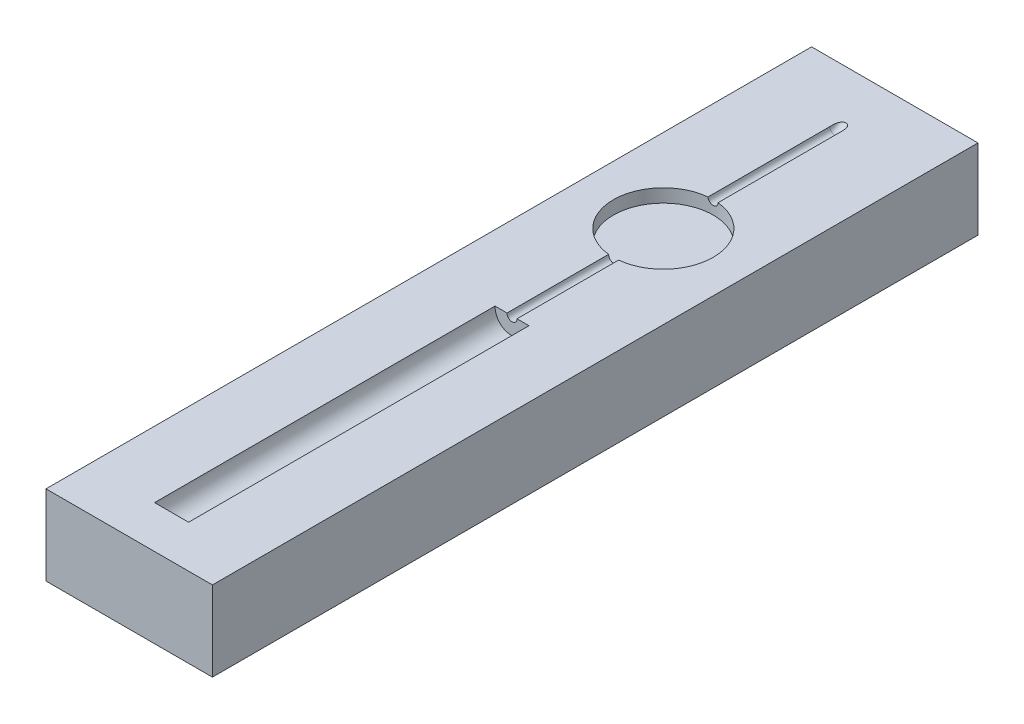
ISO-10303-21;
HEADER;
FILE_DESCRIPTION(('STEP AP214'),'2;1');
FILE_NAME('part.step','',(''),(''),'','','');
FILE_SCHEMA(('AUTOMOTIVE_DESIGN { 1 0 10303 214 1 1 1 1 }'));
ENDSEC;
DATA;
#1=APPLICATION_CONTEXT('core data for automotive mechanical design processes');
#2=APPLICATION_PROTOCOL_DEFINITION('international standard','automotive_design',2000,#1);
#3=PRODUCT_CONTEXT('',#1,'mechanical');
#4=PRODUCT('Part','Part','',(#3));
#5=PRODUCT_RELATED_PRODUCT_CATEGORY('part','',(#4));
#6=PRODUCT_DEFINITION_FORMATION('','',#4);
#7=PRODUCT_DEFINITION_CONTEXT('part definition',#1,'design');
#8=PRODUCT_DEFINITION('design','',#6,#7);
#9=PRODUCT_DEFINITION_SHAPE('','',#8);
#10=(LENGTH_UNIT() NAMED_UNIT(*) SI_UNIT(.MILLI.,.METRE.));
#11=(NAMED_UNIT(*) PLANE_ANGLE_UNIT() SI_UNIT($,.RADIAN.));
#12=(NAMED_UNIT(*) SI_UNIT($,.STERADIAN.) SOLID_ANGLE_UNIT());
#13=UNCERTAINTY_MEASURE_WITH_UNIT(LENGTH_MEASURE(1.E-05),#10,'distance_accuracy_value','');
#14=(GEOMETRIC_REPRESENTATION_CONTEXT(3) GLOBAL_UNCERTAINTY_ASSIGNED_CONTEXT((#13)) GLOBAL_UNIT_ASSIGNED_CONTEXT((#10,
#11,#12)) REPRESENTATION_CONTEXT('',''));
#15=CARTESIAN_POINT('',(0.,0.,0.));
#16=DIRECTION('',(0.,0.,1.));
#17=DIRECTION('',(1.,0.,0.));
#18=AXIS2_PLACEMENT_3D('',#15,#16,#17);
#19=CARTESIAN_POINT('',(0.,0.,0.));
#20=DIRECTION('',(0.,1.,0.));
#21=DIRECTION('',(0.,0.,1.));
#22=AXIS2_PLACEMENT_3D('',#19,#20,#21);
#23=PLANE('',#22);
#24=DIRECTION('',(-1.,0.,0.));
#25=VECTOR('',#24,1.);
#26=CARTESIAN_POINT('',(-25.,0.,115.));
#27=LINE('',#26,#25);
#28=CARTESIAN_POINT('',(25.,0.,115.));
#29=VERTEX_POINT('',#28);
#30=CARTESIAN_POINT('',(-25.,0.,115.));
#31=VERTEX_POINT('',#30);
#32=EDGE_CURVE('E274',#29,#31,#27,.T.);
#33=ORIENTED_EDGE('',*,*,#32,.F.);
#34=DIRECTION('',(0.,0.,1.));
#35=VECTOR('',#34,1.);
#36=CARTESIAN_POINT('',(25.,0.,115.));
#37=LINE('',#36,#35);
#38=CARTESIAN_POINT('',(25.,0.,-115.));
#39=VERTEX_POINT('',#38);
#40=EDGE_CURVE('E271',#39,#29,#37,.T.);
#41=ORIENTED_EDGE('',*,*,#40,.F.);
#42=DIRECTION('',(-1.,0.,0.));
#43=VECTOR('',#42,1.);
#44=CARTESIAN_POINT('',(-25.,0.,-115.));
#45=LINE('',#44,#43);
#46=CARTESIAN_POINT('',(-25.,0.,-115.));
#47=VERTEX_POINT('',#46);
#48=EDGE_CURVE('E162',#39,#47,#45,.T.);
#49=ORIENTED_EDGE('',*,*,#48,.T.);
#50=DIRECTION('',(0.,0.,1.));
#51=VECTOR('',#50,1.);
#52=CARTESIAN_POINT('',(-25.,0.,115.));
#53=LINE('',#52,#51);
#54=EDGE_CURVE('E277',#47,#31,#53,.T.);
#55=ORIENTED_EDGE('',*,*,#54,.T.);
#56=EDGE_LOOP('',(#33,#41,#49,#55));
#57=FACE_BOUND('',#56,.T.);
#58=DIRECTION('',(1.,0.,0.));
#59=VECTOR('',#58,1.);
#60=CARTESIAN_POINT('',(-5.105,0.,0.));
#61=LINE('',#60,#59);
#62=CARTESIAN_POINT('',(1.5,0.,0.));
#63=VERTEX_POINT('',#62);
#64=CARTESIAN_POINT('',(5.105,0.,0.));
#65=VERTEX_POINT('',#64);
#66=EDGE_CURVE('E154',#63,#65,#61,.T.);
#67=ORIENTED_EDGE('',*,*,#66,.T.);
#68=DIRECTION('',(0.,0.,-1.));
#69=VECTOR('',#68,1.);
#70=CARTESIAN_POINT('',(5.105,0.,102.27454));
#71=LINE('',#70,#69);
#72=CARTESIAN_POINT('',(5.105,0.,102.27454));
#73=VERTEX_POINT('',#72);
#74=EDGE_CURVE('E11',#65,#73,#71,.F.);
#75=ORIENTED_EDGE('',*,*,#74,.T.);
#76=DIRECTION('',(1.,0.,0.));
#77=VECTOR('',#76,1.);
#78=CARTESIAN_POINT('',(-5.105,0.,102.27454));
#79=LINE('',#78,#77);
#80=CARTESIAN_POINT('',(1.5,0.,102.27454));
#81=VERTEX_POINT('',#80);
#82=EDGE_CURVE('E140',#81,#73,#79,.T.);
#83=ORIENTED_EDGE('',*,*,#82,.F.);
#84=DIRECTION('',(1.,0.,0.));
#85=VECTOR('',#84,1.);
#86=CARTESIAN_POINT('',(0.,0.,102.27454));
#87=LINE('',#86,#85);
#88=CARTESIAN_POINT('',(-1.5,0.,102.27454));
#89=VERTEX_POINT('',#88);
#90=EDGE_CURVE('E125',#89,#81,#87,.T.);
#91=ORIENTED_EDGE('',*,*,#90,.F.);
#92=CARTESIAN_POINT('',(-5.105,0.,102.27454));
#93=VERTEX_POINT('',#92);
#94=EDGE_CURVE('E142',#93,#89,#79,.T.);
#95=ORIENTED_EDGE('',*,*,#94,.F.);
#96=DIRECTION('',(0.,0.,-1.));
#97=VECTOR('',#96,1.);
#98=CARTESIAN_POINT('',(-5.105,0.,102.27454));
#99=LINE('',#98,#97);
#100=CARTESIAN_POINT('',(-5.105,0.,0.));
#101=VERTEX_POINT('',#100);
#102=EDGE_CURVE('E49',#93,#101,#99,.T.);
#103=ORIENTED_EDGE('',*,*,#102,.T.);
#104=CARTESIAN_POINT('',(-1.5,0.,0.));
#105=VERTEX_POINT('',#104);
#106=EDGE_CURVE('E150',#101,#105,#61,.T.);
#107=ORIENTED_EDGE('',*,*,#106,.T.);
#108=DIRECTION('',(0.,0.,-1.));
#109=VECTOR('',#108,1.);
#110=CARTESIAN_POINT('',(-1.5,0.,102.27454));
#111=LINE('',#110,#109);
#112=CARTESIAN_POINT('',(-1.5,0.,-30.5378801602227));
#113=VERTEX_POINT('',#112);
#114=EDGE_CURVE('E250',#105,#113,#111,.T.);
#115=ORIENTED_EDGE('',*,*,#114,.T.);
#116=CARTESIAN_POINT('',(0.,0.,-45.462691716822));
#117=DIRECTION('',(0.,1.,0.));
#118=DIRECTION('',(0.,0.,1.));
#119=AXIS2_PLACEMENT_3D('',#116,#117,#118);
#120=CIRCLE('',#119,15.);
#121=CARTESIAN_POINT('',(-1.5,0.,-60.3875032734213));
#122=VERTEX_POINT('',#121);
#123=EDGE_CURVE('E219',#122,#113,#120,.T.);
#124=ORIENTED_EDGE('',*,*,#123,.F.);
#125=DIRECTION('',(0.,0.,-1.));
#126=VECTOR('',#125,1.);
#127=CARTESIAN_POINT('',(-1.5,0.,102.27454));
#128=LINE('',#127,#126);
#129=CARTESIAN_POINT('',(-1.5,0.,-97.));
#130=VERTEX_POINT('',#129);
#131=EDGE_CURVE('E220',#122,#130,#128,.T.);
#132=ORIENTED_EDGE('',*,*,#131,.T.);
#133=CARTESIAN_POINT('',(0.,0.,-100.35410196625));
#134=CARTESIAN_POINT('',(0.0672307867824901,0.,-100.354096630468));
#135=CARTESIAN_POINT('',(0.134554806970392,0.,-100.347994758443));
#136=CARTESIAN_POINT('',(0.267123437779811,0.,-100.32392435141));
#137=CARTESIAN_POINT('',(0.332363320649592,0.,-100.305930602289));
#138=CARTESIAN_POINT('',(0.458517043906197,0.,-100.259204560447));
#139=CARTESIAN_POINT('',(0.519448956126106,0.,-100.230520739154));
#140=CARTESIAN_POINT('',(0.635925306877005,0.,-100.163870009883));
#141=CARTESIAN_POINT('',(0.691471005151739,0.,-100.125905279901));
#142=CARTESIAN_POINT('',(0.799248566690285,0.,-100.040028521794));
#143=CARTESIAN_POINT('',(0.851137095835231,0.,-99.9916885328437));
#144=CARTESIAN_POINT('',(0.947720598887968,0.,-99.8883103355379));
#145=CARTESIAN_POINT('',(0.992410158207161,0.,-99.8332671396074));
#146=CARTESIAN_POINT('',(1.09911156459117,0.,-99.6838803764388));
#147=CARTESIAN_POINT('',(1.15564343285398,0.,-99.5856145816269));
#148=CARTESIAN_POINT('',(1.25237794690646,0.,-99.3815266486391));
#149=CARTESIAN_POINT('',(1.29256117388616,0.,-99.2756956989443));
#150=CARTESIAN_POINT('',(1.36308003437101,0.,-99.0480333939666));
#151=CARTESIAN_POINT('',(1.39183487387045,0.,-98.9257270013727));
#152=CARTESIAN_POINT('',(1.43678650873765,0.,-98.678757161986));
#153=CARTESIAN_POINT('',(1.45295915056854,0.,-98.5540896500442));
#154=CARTESIAN_POINT('',(1.4767550206887,0.,-98.3031379341571));
#155=CARTESIAN_POINT('',(1.48431713217746,0.,-98.1768485294598));
#156=CARTESIAN_POINT('',(1.49434362566474,0.,-97.92405197641));
#157=CARTESIAN_POINT('',(1.49680552441963,0.,-97.7975447519895));
#158=CARTESIAN_POINT('',(1.49904038727571,0.,-97.5898828441239));
#159=CARTESIAN_POINT('',(1.4994609826423,0.,-97.5087310653113));
#160=CARTESIAN_POINT('',(1.49992619235798,0.,-97.3464260708259));
#161=CARTESIAN_POINT('',(1.49997080632203,0.,-97.2652728551517));
#162=CARTESIAN_POINT('',(1.50000795710064,0.,-97.1029435905487));
#163=CARTESIAN_POINT('',(1.50000047908994,0.,-97.0217675416949));
#164=CARTESIAN_POINT('',(1.49999929025183,0.,-96.8594115821137));
#165=CARTESIAN_POINT('',(1.50000558006921,0.,-96.7782316713835));
#166=CARTESIAN_POINT('',(1.49983961930328,0.,-96.6162593735906));
#167=CARTESIAN_POINT('',(1.49966822086254,0.,-96.5354669865241));
#168=CARTESIAN_POINT('',(1.4987201710547,0.,-96.3738813679862));
#169=CARTESIAN_POINT('',(1.49794349673059,0.,-96.293088136599));
#170=CARTESIAN_POINT('',(1.49515570446314,0.,-96.1315602275125));
#171=CARTESIAN_POINT('',(1.49314520955794,0.,-96.0508255408376));
#172=CARTESIAN_POINT('',(1.48710145400768,0.,-95.889433657129));
#173=CARTESIAN_POINT('',(1.48306842387874,0.,-95.8087764523138));
#174=CARTESIAN_POINT('',(1.47299277494263,0.,-95.6611943308));
#175=CARTESIAN_POINT('',(1.46740193128519,0.,-95.5942401943196));
#176=CARTESIAN_POINT('',(1.45361415230674,0.,-95.4605960115322));
#177=CARTESIAN_POINT('',(1.44541698821279,0.,-95.3939059889286));
#178=CARTESIAN_POINT('',(1.41599227240695,0.,-95.1943212039969));
#179=CARTESIAN_POINT('',(1.38993947024899,0.,-95.0620704020673));
#180=CARTESIAN_POINT('',(1.31923487077032,0.,-94.7999296565847));
#181=CARTESIAN_POINT('',(1.27429014962835,0.,-94.6701120905019));
#182=CARTESIAN_POINT('',(1.18930860246558,0.,-94.4835763311824));
#183=CARTESIAN_POINT('',(1.15809832438021,0.,-94.4228257030507));
#184=CARTESIAN_POINT('',(1.0893534319166,0.,-94.3050446656123));
#185=CARTESIAN_POINT('',(1.05182447438382,0.,-94.2480109914699));
#186=CARTESIAN_POINT('',(0.964180180254391,0.,-94.1309764845206));
#187=CARTESIAN_POINT('',(0.913029677374067,0.,-94.0717381517388));
#188=CARTESIAN_POINT('',(0.801996887643482,0.,-93.962027139652));
#189=CARTESIAN_POINT('',(0.742117344625086,0.,-93.911551716752));
#190=CARTESIAN_POINT('',(0.613784947728565,0.,-93.8214897023238));
#191=CARTESIAN_POINT('',(0.545262173574133,0.,-93.7820014528515));
#192=CARTESIAN_POINT('',(0.40183050332942,0.,-93.7170777791347));
#193=CARTESIAN_POINT('',(0.326927302291188,0.,-93.6916299712752));
#194=CARTESIAN_POINT('',(0.183162566087263,0.,-93.6588667243544));
#195=CARTESIAN_POINT('',(0.114726974066683,0.,-93.6496724175345));
#196=CARTESIAN_POINT('',(-0.0226618598245099,0.,-93.644019500176));
#197=CARTESIAN_POINT('',(-0.0916148809165694,0.,-93.6475557352935));
#198=CARTESIAN_POINT('',(-0.222183945601393,0.,-93.6663289478414));
#199=CARTESIAN_POINT('',(-0.283942726359025,0.,-93.6805976727889));
#200=CARTESIAN_POINT('',(-0.404299870766039,0.,-93.7189355164065));
#201=CARTESIAN_POINT('',(-0.462898993324443,0.,-93.7430022697356));
#202=CARTESIAN_POINT('',(-0.577791646591143,0.,-93.8008768156348));
#203=CARTESIAN_POINT('',(-0.633918403822543,0.,-93.8350135673147));
#204=CARTESIAN_POINT('',(-0.740565367096012,0.,-93.9111810508322));
#205=CARTESIAN_POINT('',(-0.791078590207105,0.,-93.9532214432829));
#206=CARTESIAN_POINT('',(-0.905523365257182,0.,-94.0623241232702));
#207=CARTESIAN_POINT('',(-0.966428419692527,0.,-94.1325659549204));
#208=CARTESIAN_POINT('',(-1.07589226119924,0.,-94.2818537058273));
#209=CARTESIAN_POINT('',(-1.12445542473782,0.,-94.3608964899041));
#210=CARTESIAN_POINT('',(-1.19892394114143,0.,-94.5031559157308));
#211=CARTESIAN_POINT('',(-1.22742712078311,0.,-94.5650488662927));
#212=CARTESIAN_POINT('',(-1.27887287693451,0.,-94.6911377801969));
#213=CARTESIAN_POINT('',(-1.30181177272873,0.,-94.755335235893));
#214=CARTESIAN_POINT('',(-1.34285376332618,0.,-94.8856900374737));
#215=CARTESIAN_POINT('',(-1.36092466805315,0.,-94.95185736376));
#216=CARTESIAN_POINT('',(-1.39268769421189,0.,-95.0851544222037));
#217=CARTESIAN_POINT('',(-1.40638370944741,0.,-95.1522832426745));
#218=CARTESIAN_POINT('',(-1.44273965338481,0.,-95.359094797791));
#219=CARTESIAN_POINT('',(-1.45938735309894,0.,-95.4998230797753));
#220=CARTESIAN_POINT('',(-1.48263843909134,0.,-95.7821596026391));
#221=CARTESIAN_POINT('',(-1.48922505318717,0.,-95.9237689186114));
#222=CARTESIAN_POINT('',(-1.49728720656969,0.,-96.2079105692423));
#223=CARTESIAN_POINT('',(-1.49873316533856,0.,-96.3504435328242));
#224=CARTESIAN_POINT('',(-1.49972794014842,0.,-96.56417706356));
#225=CARTESIAN_POINT('',(-1.49986402532073,0.,-96.6353809411881));
#226=CARTESIAN_POINT('',(-1.49999936674925,0.,-96.7777889681776));
#227=CARTESIAN_POINT('',(-1.4999986242859,0.,-96.8489931175302));
#228=CARTESIAN_POINT('',(-1.50000062546551,0.,-96.9914406806675));
#229=CARTESIAN_POINT('',(-1.50000337104237,0.,-97.062684094324));
#230=CARTESIAN_POINT('',(-1.49999067703257,0.,-97.205171548254));
#231=CARTESIAN_POINT('',(-1.499975237288,0.,-97.2764155885276));
#232=CARTESIAN_POINT('',(-1.49975593763766,0.,-97.418955440924));
#233=CARTESIAN_POINT('',(-1.49955194113274,0.,-97.4902512531329));
#234=CARTESIAN_POINT('',(-1.49863769333797,0.,-97.6328392935198));
#235=CARTESIAN_POINT('',(-1.49792744491025,0.,-97.7041315217159));
#236=CARTESIAN_POINT('',(-1.49442548198198,0.,-97.9173032472891));
#237=CARTESIAN_POINT('',(-1.49026901098955,0.,-98.0591676633966));
#238=CARTESIAN_POINT('',(-1.47382272008508,0.,-98.3423848667529));
#239=CARTESIAN_POINT('',(-1.46154330990682,0.,-98.4837380763143));
#240=CARTESIAN_POINT('',(-1.43457622693776,0.,-98.6822782412732));
#241=CARTESIAN_POINT('',(-1.42552173551113,0.,-98.7402210705499));
#242=CARTESIAN_POINT('',(-1.40466174612849,0.,-98.8556489726133));
#243=CARTESIAN_POINT('',(-1.39285473725303,0.,-98.9131337759912));
#244=CARTESIAN_POINT('',(-1.36610459955229,0.,-99.0272320763171));
#245=CARTESIAN_POINT('',(-1.35116932974845,0.,-99.0838473821697));
#246=CARTESIAN_POINT('',(-1.31773701477136,0.,-99.1960018438201));
#247=CARTESIAN_POINT('',(-1.29924038772201,0.,-99.2515411251079));
#248=CARTESIAN_POINT('',(-1.23717210883961,0.,-99.4176261034724));
#249=CARTESIAN_POINT('',(-1.18738073531307,0.,-99.5259775835449));
#250=CARTESIAN_POINT('',(-1.068435924892,0.,-99.7317475206353));
#251=CARTESIAN_POINT('',(-0.999309062165405,0.,-99.8291807278118));
#252=CARTESIAN_POINT('',(-0.870099360128718,0.,-99.9731288009207));
#253=CARTESIAN_POINT('',(-0.816135198081085,0.,-100.025144093232));
#254=CARTESIAN_POINT('',(-0.700494171075523,0.,-100.119828129508));
#255=CARTESIAN_POINT('',(-0.638821931249817,0.,-100.162502436513));
#256=CARTESIAN_POINT('',(-0.508292473895478,0.,-100.236594589417));
#257=CARTESIAN_POINT('',(-0.439378035698494,0.,-100.267912490907));
#258=CARTESIAN_POINT('',(-0.296883789999179,0.,-100.316684682059));
#259=CARTESIAN_POINT('',(-0.223317057266358,0.,-100.334176109607));
#260=CARTESIAN_POINT('',(-0.124198586747207,0.,-100.347468093304));
#261=CARTESIAN_POINT('',(-0.0994278543067776,0.,-100.349952125082));
#262=CARTESIAN_POINT('',(-0.0497756744915631,0.,-100.353270037353));
#263=CARTESIAN_POINT('',(-0.0248942287416991,0.,-100.354103941984));
#264=CARTESIAN_POINT('',(0.,0.,-100.35410196625));
#265=B_SPLINE_CURVE_WITH_KNOTS('',3,(#133,#134,#135,#136,#137,#138,#139,#140,#141,#142,#143,
#144,#145,#146,#147,#148,#149,#150,#151,#152,#153,#154,#155,#156,#157,#158,#159,#160,#161,#162,
#163,#164,#165,#166,#167,#168,#169,#170,#171,#172,#173,#174,#175,#176,#177,#178,#179,#180,#181,
#182,#183,#184,#185,#186,#187,#188,#189,#190,#191,#192,#193,#194,#195,#196,#197,#198,#199,#200,
#201,#202,#203,#204,#205,#206,#207,#208,#209,#210,#211,#212,#213,#214,#215,#216,#217,#218,#219,
#220,#221,#222,#223,#224,#225,#226,#227,#228,#229,#230,#231,#232,#233,#234,#235,#236,#237,#238,
#239,#240,#241,#242,#243,#244,#245,#246,#247,#248,#249,#250,#251,#252,#253,#254,#255,#256,#257,
#258,#259,#260,#261,#262,#263,#264),.UNSPECIFIED.,.T.,.F.,(4,2,2,2,2,2,2,2,2,2,2,2,2,2,2,2,2,2,
2,2,2,2,2,2,2,2,2,2,2,2,2,2,2,2,2,2,2,2,2,2,2,2,2,2,2,2,2,2,2,2,2,2,2,2,2,2,2,2,2,2,2,2,2,2,2,
4),(0.,0.201585600358813,0.403599995872726,0.604709337019922,0.805771528090704,1.0177431534156,
1.22987347278895,1.56801710323283,1.90656121406364,2.28255037187327,2.65925953205925,
3.03862619197159,3.41817751842479,3.6616362870851,3.90509530507068,4.14862361383156,
4.3921633279072,4.63454047338048,4.87692681222525,5.11919085467489,5.36142729163519,
5.56294381950068,5.76447804060964,6.16802142382924,6.57806715314455,6.78263671663088,
6.98702410211797,7.22095116644405,7.45480485752245,7.69068887687493,7.92636451349124,
8.13238123160203,8.33831454701634,8.52761271788079,8.71686521736575,8.91315545778999,
9.10968720214218,9.38705420548179,9.66432271607888,9.86846917050204,10.072750299645,
10.2783508271513,10.4837678498414,10.9082021655053,11.3333432588339,11.7609267878819,
11.9745406612173,12.1881525355312,12.4018828961215,12.6156151128089,12.8295022883671,
13.0433882547104,13.4690909063593,13.8942490643917,14.0701319829264,14.2461116758759,
14.4216544530027,14.5971766329476,14.9532772374,15.3088908115672,15.5329147100284,
15.7568048254547,15.9826200719351,16.2078266982679,16.282470945335,16.3571141004508),.UNSPECIFIED.);
#266=CARTESIAN_POINT('',(1.5,0.,-97.));
#267=VERTEX_POINT('',#266);
#268=EDGE_CURVE('E212',#130,#267,#265,.T.);
#269=ORIENTED_EDGE('',*,*,#268,.T.);
#270=DIRECTION('',(0.,0.,-1.));
#271=VECTOR('',#270,1.);
#272=CARTESIAN_POINT('',(1.5,0.,102.27454));
#273=LINE('',#272,#271);
#274=CARTESIAN_POINT('',(1.5,0.,-60.3875032734213));
#275=VERTEX_POINT('',#274);
#276=EDGE_CURVE('E248',#267,#275,#273,.F.);
#277=ORIENTED_EDGE('',*,*,#276,.T.);
#278=CARTESIAN_POINT('',(1.5,0.,-30.5378801602227));
#279=VERTEX_POINT('',#278);
#280=EDGE_CURVE('E247',#279,#275,#120,.T.);
#281=ORIENTED_EDGE('',*,*,#280,.F.);
#282=DIRECTION('',(0.,0.,-1.));
#283=VECTOR('',#282,1.);
#284=CARTESIAN_POINT('',(1.5,0.,102.27454));
#285=LINE('',#284,#283);
#286=EDGE_CURVE('E133',#279,#63,#285,.F.);
#287=ORIENTED_EDGE('',*,*,#286,.T.);
#288=EDGE_LOOP('',(#67,#75,#83,#91,#95,#103,#107,#115,#124,#132,#269,#277,#281,#287));
#289=FACE_BOUND('',#288,.T.);
#290=ADVANCED_FACE('F41',(#57,#289),#23,.T.);
#291=CARTESIAN_POINT('',(-25.,-24.,115.));
#292=DIRECTION('',(1.,0.,0.));
#293=DIRECTION('',(0.,0.,-1.));
#294=AXIS2_PLACEMENT_3D('',#291,#292,#293);
#295=PLANE('',#294);
#296=ORIENTED_EDGE('',*,*,#54,.F.);
#297=DIRECTION('',(0.,1.,0.));
#298=VECTOR('',#297,1.);
#299=CARTESIAN_POINT('',(-25.,-24.,-115.));
#300=LINE('',#299,#298);
#301=CARTESIAN_POINT('',(-25.,-24.,-115.));
#302=VERTEX_POINT('',#301);
#303=EDGE_CURVE('E283',#302,#47,#300,.T.);
#304=ORIENTED_EDGE('',*,*,#303,.F.);
#305=DIRECTION('',(0.,0.,-1.));
#306=VECTOR('',#305,1.);
#307=CARTESIAN_POINT('',(-25.,-24.,115.));
#308=LINE('',#307,#306);
#309=CARTESIAN_POINT('',(-25.,-24.,115.));
#310=VERTEX_POINT('',#309);
#311=EDGE_CURVE('E287',#310,#302,#308,.T.);
#312=ORIENTED_EDGE('',*,*,#311,.F.);
#313=DIRECTION('',(0.,1.,0.));
#314=VECTOR('',#313,1.);
#315=CARTESIAN_POINT('',(-25.,-24.,115.));
#316=LINE('',#315,#314);
#317=EDGE_CURVE('E273',#310,#31,#316,.T.);
#318=ORIENTED_EDGE('',*,*,#317,.T.);
#319=EDGE_LOOP('',(#296,#304,#312,#318));
#320=FACE_BOUND('',#319,.T.);
#321=ADVANCED_FACE('F196',(#320),#295,.F.);
#322=CARTESIAN_POINT('',(0.,-24.,0.));
#323=DIRECTION('',(0.,1.,0.));
#324=DIRECTION('',(0.,0.,1.));
#325=AXIS2_PLACEMENT_3D('',#322,#323,#324);
#326=PLANE('',#325);
#327=DIRECTION('',(1.,0.,0.));
#328=VECTOR('',#327,1.);
#329=CARTESIAN_POINT('',(-25.,-24.,115.));
#330=LINE('',#329,#328);
#331=CARTESIAN_POINT('',(25.,-24.,115.));
#332=VERTEX_POINT('',#331);
#333=EDGE_CURVE('E261',#310,#332,#330,.T.);
#334=ORIENTED_EDGE('',*,*,#333,.F.);
#335=ORIENTED_EDGE('',*,*,#311,.T.);
#336=DIRECTION('',(1.,0.,0.));
#337=VECTOR('',#336,1.);
#338=CARTESIAN_POINT('',(-25.,-24.,-115.));
#339=LINE('',#338,#337);
#340=CARTESIAN_POINT('',(25.,-24.,-115.));
#341=VERTEX_POINT('',#340);
#342=EDGE_CURVE('E267',#302,#341,#339,.T.);
#343=ORIENTED_EDGE('',*,*,#342,.T.);
#344=DIRECTION('',(0.,0.,-1.));
#345=VECTOR('',#344,1.);
#346=CARTESIAN_POINT('',(25.,-24.,115.));
#347=LINE('',#346,#345);
#348=EDGE_CURVE('E263',#332,#341,#347,.T.);
#349=ORIENTED_EDGE('',*,*,#348,.F.);
#350=EDGE_LOOP('',(#334,#335,#343,#349));
#351=FACE_BOUND('',#350,.T.);
#352=ADVANCED_FACE('F202',(#351),#326,.F.);
#353=CARTESIAN_POINT('',(-25.,-24.,115.));
#354=DIRECTION('',(0.,0.,1.));
#355=DIRECTION('',(1.,0.,0.));
#356=AXIS2_PLACEMENT_3D('',#353,#354,#355);
#357=PLANE('',#356);
#358=DIRECTION('',(0.,1.,0.));
#359=VECTOR('',#358,1.);
#360=CARTESIAN_POINT('',(25.,-24.,115.));
#361=LINE('',#360,#359);
#362=EDGE_CURVE('E64',#332,#29,#361,.T.);
#363=ORIENTED_EDGE('',*,*,#362,.T.);
#364=ORIENTED_EDGE('',*,*,#32,.T.);
#365=ORIENTED_EDGE('',*,*,#317,.F.);
#366=ORIENTED_EDGE('',*,*,#333,.T.);
#367=EDGE_LOOP('',(#363,#364,#365,#366));
#368=FACE_BOUND('',#367,.T.);
#369=ADVANCED_FACE('F210',(#368),#357,.T.);
#370=CARTESIAN_POINT('',(-25.,-24.,-115.));
#371=DIRECTION('',(0.,0.,1.));
#372=DIRECTION('',(1.,0.,0.));
#373=AXIS2_PLACEMENT_3D('',#370,#371,#372);
#374=PLANE('',#373);
#375=ORIENTED_EDGE('',*,*,#48,.F.);
#376=DIRECTION('',(0.,1.,0.));
#377=VECTOR('',#376,1.);
#378=CARTESIAN_POINT('',(25.,-24.,-115.));
#379=LINE('',#378,#377);
#380=EDGE_CURVE('E285',#341,#39,#379,.T.);
#381=ORIENTED_EDGE('',*,*,#380,.F.);
#382=ORIENTED_EDGE('',*,*,#342,.F.);
#383=ORIENTED_EDGE('',*,*,#303,.T.);
#384=EDGE_LOOP('',(#375,#381,#382,#383));
#385=FACE_BOUND('',#384,.T.);
#386=ADVANCED_FACE('F295',(#385),#374,.F.);
#387=CARTESIAN_POINT('',(25.,-24.,115.));
#388=DIRECTION('',(1.,0.,0.));
#389=DIRECTION('',(0.,0.,-1.));
#390=AXIS2_PLACEMENT_3D('',#387,#388,#389);
#391=PLANE('',#390);
#392=ORIENTED_EDGE('',*,*,#380,.T.);
#393=ORIENTED_EDGE('',*,*,#40,.T.);
#394=ORIENTED_EDGE('',*,*,#362,.F.);
#395=ORIENTED_EDGE('',*,*,#348,.T.);
#396=EDGE_LOOP('',(#392,#393,#394,#395));
#397=FACE_BOUND('',#396,.T.);
#398=ADVANCED_FACE('F43',(#397),#391,.T.);
#399=CARTESIAN_POINT('',(0.,0.,102.27454));
#400=DIRECTION('',(0.,0.,-1.));
#401=DIRECTION('',(-1.,0.,0.));
#402=AXIS2_PLACEMENT_3D('',#399,#400,#401);
#403=CYLINDRICAL_SURFACE('',#402,1.5);
#404=CARTESIAN_POINT('',(-1.5,0.,-30.5378801602227));
#405=CARTESIAN_POINT('',(-1.49999636009027,-0.0840293462604036,-30.5378791748684));
#406=CARTESIAN_POINT('',(-1.49291528847371,-0.168114252617759,-30.5371628619087));
#407=CARTESIAN_POINT('',(-1.46477447214534,-0.333952779440303,-30.5343754034502));
#408=CARTESIAN_POINT('',(-1.44369932232965,-0.415703727056235,-30.5323027649037));
#409=CARTESIAN_POINT('',(-1.38819017410339,-0.574448728826858,-30.5270397211112));
#410=CARTESIAN_POINT('',(-1.35376427444085,-0.65144563408716,-30.5238499936201));
#411=CARTESIAN_POINT('',(-1.27254640108665,-0.798551688437624,-30.5167130082447));
#412=CARTESIAN_POINT('',(-1.22575688343889,-0.868662201725576,-30.512765900857));
#413=CARTESIAN_POINT('',(-1.12095714299806,-1.00027689548625,-30.5045428161735));
#414=CARTESIAN_POINT('',(-1.06291112716239,-1.06175251425567,-30.500265816743));
#415=CARTESIAN_POINT('',(-0.937322572979346,-1.17410641350535,-30.4918741382862));
#416=CARTESIAN_POINT('',(-0.869779600359853,-1.22498420910947,-30.4877594666938));
#417=CARTESIAN_POINT('',(-0.726939542476481,-1.31479688551073,-30.4801459694879));
#418=CARTESIAN_POINT('',(-0.651626493794354,-1.3537064981905,-30.4766484534023));
#419=CARTESIAN_POINT('',(-0.495494976431266,-1.41831664972302,-30.4706744636854));
#420=CARTESIAN_POINT('',(-0.414676642002329,-1.4440175105542,-30.468197965166));
#421=CARTESIAN_POINT('',(-0.250117174114425,-1.48139686402987,-30.4645522182566));
#422=CARTESIAN_POINT('',(-0.166386790547373,-1.49312224912492,-30.4633785991797));
#423=CARTESIAN_POINT('',(0.00186111103341406,-1.50236290370058,-30.4624559828416));
#424=CARTESIAN_POINT('',(0.0863786085816914,-1.49987854161941,-30.4627069486429));
#425=CARTESIAN_POINT('',(0.25348326609684,-1.48080829102477,-30.4646016471542));
#426=CARTESIAN_POINT('',(0.336076244902468,-1.46427282665416,-30.4662403995463));
#427=CARTESIAN_POINT('',(0.497308769256799,-1.41764830658007,-30.470720777848));
#428=CARTESIAN_POINT('',(0.575948263436592,-1.38755907481864,-30.4735624193827));
#429=CARTESIAN_POINT('',(0.727200472019379,-1.31462585511834,-30.4801376545632));
#430=CARTESIAN_POINT('',(0.799802356472474,-1.27175955370476,-30.4838728063356));
#431=CARTESIAN_POINT('',(0.93680026976129,-1.17450521499545,-30.4918159490309));
#432=CARTESIAN_POINT('',(1.00119605784124,-1.12011683978223,-30.4960239538198));
#433=CARTESIAN_POINT('',(1.12024915773403,-1.00107865572953,-30.5044623148042));
#434=CARTESIAN_POINT('',(1.17486261928552,-0.936384982887635,-30.5086926882265));
#435=CARTESIAN_POINT('',(1.27246130303688,-0.798724702183834,-30.5166806178986));
#436=CARTESIAN_POINT('',(1.31544650836933,-0.725758082321787,-30.5204381734625));
#437=CARTESIAN_POINT('',(1.38856827685984,-0.573589462200315,-30.5270553741097));
#438=CARTESIAN_POINT('',(1.41870213085944,-0.494386151365668,-30.5299148298336));
#439=CARTESIAN_POINT('',(1.46523110345638,-0.332009093077968,-30.5344081887579));
#440=CARTESIAN_POINT('',(1.48162664061455,-0.248835466668833,-30.5360421292954));
#441=CARTESIAN_POINT('',(1.50015716308794,-0.0812637307057384,-30.5378930089107));
#442=CARTESIAN_POINT('',(1.50235349497082,0.00312753039724973,-30.5381160436079));
#443=CARTESIAN_POINT('',(1.49258437030704,0.171076898734294,-30.5371359465004));
#444=CARTESIAN_POINT('',(1.48061910511463,0.254635017210551,-30.535932833966));
#445=CARTESIAN_POINT('',(1.44291776176128,0.418367373417512,-30.5322415504859));
#446=CARTESIAN_POINT('',(1.41721069078336,0.498548356641988,-30.5297560868018));
#447=CARTESIAN_POINT('',(1.35278507951391,0.653460077595458,-30.52378235124));
#448=CARTESIAN_POINT('',(1.31406624117538,0.728190690430772,-30.5202940563919));
#449=CARTESIAN_POINT('',(1.22456250213483,0.870359961043163,-30.5126929514863));
#450=CARTESIAN_POINT('',(1.17373694976104,0.93777291294938,-30.5085780546019));
#451=CARTESIAN_POINT('',(1.06152080017676,1.0631325799111,-30.5001942274442));
#452=CARTESIAN_POINT('',(1.0001299413722,1.12107906051011,-30.495925293359));
#453=CARTESIAN_POINT('',(0.868259706339711,1.22607245009714,-30.4876959990824));
#454=CARTESIAN_POINT('',(0.797748383954178,1.27307933937933,-30.4837368059898));
#455=CARTESIAN_POINT('',(0.649796576125697,1.35458380275962,-30.4765900852225));
#456=CARTESIAN_POINT('',(0.572356185644439,1.38908154826066,-30.4734025469746));
#457=CARTESIAN_POINT('',(0.412884189649223,1.444520651483,-30.4681635606119));
#458=CARTESIAN_POINT('',(0.330861056474939,1.46548618098782,-30.4661100877372));
#459=CARTESIAN_POINT('',(0.164437220975519,1.49334460436977,-30.4633622976172));
#460=CARTESIAN_POINT('',(0.0800365855383271,1.50023789375106,-30.4626679421735));
#461=CARTESIAN_POINT('',(-0.0883533361136188,1.49975060034009,-30.4627166421229));
#462=CARTESIAN_POINT('',(-0.172342810836791,1.49243214474501,-30.4634534411719));
#463=CARTESIAN_POINT('',(-0.337892832534543,1.46385938151454,-30.4662693131581));
#464=CARTESIAN_POINT('',(-0.419453377602548,1.44260506294055,-30.4683483871489));
#465=CARTESIAN_POINT('',(-0.577829863151615,1.3867811139106,-30.4736158596125));
#466=CARTESIAN_POINT('',(-0.654646449116292,1.35221329959876,-30.4768041067732));
#467=CARTESIAN_POINT('',(-0.801396900232193,1.27075024662453,-30.4839345305775));
#468=CARTESIAN_POINT('',(-0.871330805652837,1.22385508009332,-30.4878767028096));
#469=CARTESIAN_POINT('',(-1.00264908664041,1.11883557146437,-30.4960939467861));
#470=CARTESIAN_POINT('',(-1.06399638932901,1.0606649756328,-30.5003703449115));
#471=CARTESIAN_POINT('',(-1.17608663908971,0.934836972681828,-30.5087628552771));
#472=CARTESIAN_POINT('',(-1.22682703777177,0.867177292246385,-30.5128789288053));
#473=CARTESIAN_POINT('',(-1.31636496063608,0.724103487120134,-30.5204959656629));
#474=CARTESIAN_POINT('',(-1.35513178199225,0.64867007801392,-30.5239953379424));
#475=CARTESIAN_POINT('',(-1.41939706214815,0.492377563130651,-30.529963795385));
#476=CARTESIAN_POINT('',(-1.44491048683479,0.411524694111429,-30.5324340420216));
#477=CARTESIAN_POINT('',(-1.47558253250029,0.275178388651328,-30.5354416037498));
#478=CARTESIAN_POINT('',(-1.48472656859734,0.220556623040358,-30.5363517377865));
#479=CARTESIAN_POINT('',(-1.49693648790767,0.110631265436169,-30.537571339157));
#480=CARTESIAN_POINT('',(-1.50000239663589,0.0553276763061099,-30.5378808090122));
#481=CARTESIAN_POINT('',(-1.5,0.,-30.5378801602227));
#482=B_SPLINE_CURVE_WITH_KNOTS('',3,(#404,#405,#406,#407,#408,#409,#410,#411,#412,#413,#414,
#415,#416,#417,#418,#419,#420,#421,#422,#423,#424,#425,#426,#427,#428,#429,#430,#431,#432,#433,
#434,#435,#436,#437,#438,#439,#440,#441,#442,#443,#444,#445,#446,#447,#448,#449,#450,#451,#452,
#453,#454,#455,#456,#457,#458,#459,#460,#461,#462,#463,#464,#465,#466,#467,#468,#469,#470,#471,
#472,#473,#474,#475,#476,#477,#478,#479,#480,#481),.UNSPECIFIED.,.T.,.F.,(4,2,2,2,2,2,2,2,2,2,2,
2,2,2,2,2,2,2,2,2,2,2,2,2,2,2,2,2,2,2,2,2,2,2,2,2,2,2,4),(0.,0.251885991654692,
0.504049727732654,0.75606073649621,1.00802172063197,1.26079742294888,1.51358468782879,
1.76690204956937,2.02021323611692,2.27267206347674,2.52512434497348,2.77667447727992,
3.02822787721461,3.2802231819962,3.53222587827793,3.78533137627502,4.03843724141344,
4.291596436769,4.54474791892549,4.79680494461648,5.04885856450305,5.3003822205679,
5.55191163841571,5.80429784717577,6.05669030584804,6.30999205227177,6.56329032777007,
6.81613489041542,7.06897234669724,7.32070700202724,7.57244185494987,7.82414237992869,
8.07584143216198,8.32859572556982,8.58141067551787,8.83486861605714,9.08803972341001,
9.25389041409069,9.41974040855723),.UNSPECIFIED.);
#483=EDGE_CURVE('E147',#113,#279,#482,.T.);
#484=ORIENTED_EDGE('',*,*,#483,.F.);
#485=ORIENTED_EDGE('',*,*,#114,.F.);
#486=CARTESIAN_POINT('',(0.,0.,0.));
#487=DIRECTION('',(0.,0.0174524064372761,0.999847695156391));
#488=DIRECTION('',(0.,0.999847695156391,-0.0174524064372761));
#489=AXIS2_PLACEMENT_3D('',#486,#487,#488);
#490=ELLIPSE('',#489,1.50022849206586,1.5);
#491=EDGE_CURVE('E152',#63,#105,#490,.F.);
#492=ORIENTED_EDGE('',*,*,#491,.F.);
#493=ORIENTED_EDGE('',*,*,#286,.F.);
#494=EDGE_LOOP('',(#484,#485,#492,#493));
#495=FACE_BOUND('',#494,.T.);
#496=ADVANCED_FACE('F176',(#495),#403,.F.);
#497=CARTESIAN_POINT('',(0.,0.,102.27454));
#498=DIRECTION('',(0.,0.,-1.));
#499=DIRECTION('',(-1.,0.,0.));
#500=AXIS2_PLACEMENT_3D('',#497,#498,#499);
#501=CYLINDRICAL_SURFACE('',#500,5.105);
#502=CARTESIAN_POINT('',(0.,0.,0.));
#503=DIRECTION('',(0.,0.0174524064372761,0.999847695156391));
#504=DIRECTION('',(0.,0.999847695156391,-0.0174524064372761));
#505=AXIS2_PLACEMENT_3D('',#502,#503,#504);
#506=ELLIPSE('',#505,5.10577763466415,5.105);
#507=EDGE_CURVE('E157',#101,#65,#506,.T.);
#508=ORIENTED_EDGE('',*,*,#507,.F.);
#509=ORIENTED_EDGE('',*,*,#102,.F.);
#510=CARTESIAN_POINT('',(0.,0.,102.27454));
#511=DIRECTION('',(0.,0.0174524064372761,-0.999847695156391));
#512=DIRECTION('',(0.,-0.999847695156391,-0.0174524064372761));
#513=AXIS2_PLACEMENT_3D('',#510,#511,#512);
#514=ELLIPSE('',#513,5.10577763466415,5.105);
#515=EDGE_CURVE('E144',#73,#93,#514,.T.);
#516=ORIENTED_EDGE('',*,*,#515,.F.);
#517=ORIENTED_EDGE('',*,*,#74,.F.);
#518=EDGE_LOOP('',(#508,#509,#516,#517));
#519=FACE_BOUND('',#518,.T.);
#520=ADVANCED_FACE('F232',(#519),#501,.F.);
#521=CARTESIAN_POINT('',(-5.105,0.,102.27454));
#522=DIRECTION('',(0.,0.0174524064372761,-0.999847695156391));
#523=DIRECTION('',(0.,0.999847695156391,0.0174524064372761));
#524=AXIS2_PLACEMENT_3D('',#521,#522,#523);
#525=PLANE('',#524);
#526=CARTESIAN_POINT('',(0.,0.,102.27454));
#527=DIRECTION('',(0.,0.0174524064372761,-0.999847695156391));
#528=DIRECTION('',(0.,-0.999847695156391,-0.0174524064372761));
#529=AXIS2_PLACEMENT_3D('',#526,#527,#528);
#530=ELLIPSE('',#529,1.50022849206586,1.5);
#531=EDGE_CURVE('E137',#89,#81,#530,.F.);
#532=ORIENTED_EDGE('',*,*,#531,.T.);
#533=ORIENTED_EDGE('',*,*,#82,.T.);
#534=ORIENTED_EDGE('',*,*,#515,.T.);
#535=ORIENTED_EDGE('',*,*,#94,.T.);
#536=EDGE_LOOP('',(#532,#533,#534,#535));
#537=FACE_BOUND('',#536,.T.);
#538=ADVANCED_FACE('F138',(#537),#525,.T.);
#539=CARTESIAN_POINT('',(-5.105,0.,0.));
#540=DIRECTION('',(0.,0.0174524064372761,0.999847695156391));
#541=DIRECTION('',(0.,-0.999847695156391,0.0174524064372761));
#542=AXIS2_PLACEMENT_3D('',#539,#540,#541);
#543=PLANE('',#542);
#544=ORIENTED_EDGE('',*,*,#491,.T.);
#545=ORIENTED_EDGE('',*,*,#106,.F.);
#546=ORIENTED_EDGE('',*,*,#507,.T.);
#547=ORIENTED_EDGE('',*,*,#66,.F.);
#548=EDGE_LOOP('',(#544,#545,#546,#547));
#549=FACE_BOUND('',#548,.T.);
#550=ADVANCED_FACE('F227',(#549),#543,.T.);
#551=CARTESIAN_POINT('',(0.,0.,102.27454));
#552=DIRECTION('',(0.,0.,1.));
#553=DIRECTION('',(0.,-1.,0.));
#554=AXIS2_PLACEMENT_3D('',#551,#552,#553);
#555=PLANE('',#554);
#556=ORIENTED_EDGE('',*,*,#90,.T.);
#557=CARTESIAN_POINT('',(0.,0.,102.27454));
#558=DIRECTION('',(0.,0.,1.));
#559=DIRECTION('',(0.,-1.,0.));
#560=AXIS2_PLACEMENT_3D('',#557,#558,#559);
#561=CIRCLE('',#560,1.5);
#562=EDGE_CURVE('E129',#89,#81,#561,.T.);
#563=ORIENTED_EDGE('',*,*,#562,.F.);
#564=EDGE_LOOP('',(#556,#563));
#565=FACE_BOUND('',#564,.T.);
#566=ADVANCED_FACE('F127',(#565),#555,.F.);
#567=ORIENTED_EDGE('',*,*,#562,.T.);
#568=ORIENTED_EDGE('',*,*,#531,.F.);
#569=EDGE_LOOP('',(#567,#568));
#570=FACE_BOUND('',#569,.T.);
#571=ADVANCED_FACE('F146',(#570),#403,.F.);
#572=CARTESIAN_POINT('',(0.,-4.,-45.462691716822));
#573=DIRECTION('',(0.,1.,0.));
#574=DIRECTION('',(0.,0.,1.));
#575=AXIS2_PLACEMENT_3D('',#572,#573,#574);
#576=CYLINDRICAL_SURFACE('',#575,15.);
#577=ORIENTED_EDGE('',*,*,#280,.T.);
#578=CARTESIAN_POINT('',(-1.5,0.,-60.3875032734213));
#579=CARTESIAN_POINT('',(-1.49999636009027,0.0840293462604039,-60.3875042587755));
#580=CARTESIAN_POINT('',(-1.49291528847371,0.168114252617759,-60.3882205717352));
#581=CARTESIAN_POINT('',(-1.46477447214534,0.333952779440304,-60.3910080301937));
#582=CARTESIAN_POINT('',(-1.44369932232965,0.415703727056235,-60.3930806687403));
#583=CARTESIAN_POINT('',(-1.38819017410339,0.574448728826858,-60.3983437125328));
#584=CARTESIAN_POINT('',(-1.35376427444085,0.65144563408716,-60.4015334400238));
#585=CARTESIAN_POINT('',(-1.27254640108665,0.798551688437624,-60.4086704253993));
#586=CARTESIAN_POINT('',(-1.22575688343889,0.868662201725577,-60.4126175327869));
#587=CARTESIAN_POINT('',(-1.12095714299806,1.00027689548625,-60.4208406174704));
#588=CARTESIAN_POINT('',(-1.06291112716239,1.06175251425567,-60.425117616901));
#589=CARTESIAN_POINT('',(-0.937322572979345,1.17410641350535,-60.4335092953577));
#590=CARTESIAN_POINT('',(-0.869779600359852,1.22498420910947,-60.4376239669502));
#591=CARTESIAN_POINT('',(-0.72693954247648,1.31479688551073,-60.445237464156));
#592=CARTESIAN_POINT('',(-0.651626493794353,1.3537064981905,-60.4487349802417));
#593=CARTESIAN_POINT('',(-0.495494976431265,1.41831664972302,-60.4547089699585));
#594=CARTESIAN_POINT('',(-0.414676642002327,1.4440175105542,-60.4571854684779));
#595=CARTESIAN_POINT('',(-0.250117174114423,1.48139686402987,-60.4608312153874));
#596=CARTESIAN_POINT('',(-0.166386790547371,1.49312224912492,-60.4620048344642));
#597=CARTESIAN_POINT('',(0.00186111103341581,1.50236290370058,-60.4629274508024));
#598=CARTESIAN_POINT('',(0.086378608581693,1.49987854161941,-60.462676485001));
#599=CARTESIAN_POINT('',(0.253483266096841,1.48080829102477,-60.4607817864897));
#600=CARTESIAN_POINT('',(0.336076244902469,1.46427282665416,-60.4591430340977));
#601=CARTESIAN_POINT('',(0.4973087692568,1.41764830658007,-60.4546626557959));
#602=CARTESIAN_POINT('',(0.575948263436594,1.38755907481864,-60.4518210142613));
#603=CARTESIAN_POINT('',(0.72720047201938,1.31462585511834,-60.4452457790807));
#604=CARTESIAN_POINT('',(0.799802356472476,1.27175955370476,-60.4415106273083));
#605=CARTESIAN_POINT('',(0.936800269761291,1.17450521499545,-60.4335674846131));
#606=CARTESIAN_POINT('',(1.00119605784124,1.12011683978223,-60.4293594798241));
#607=CARTESIAN_POINT('',(1.12024915773403,1.00107865572953,-60.4209211188397));
#608=CARTESIAN_POINT('',(1.17486261928552,0.936384982887634,-60.4166907454174));
#609=CARTESIAN_POINT('',(1.27246130303688,0.798724702183833,-60.4087028157453));
#610=CARTESIAN_POINT('',(1.31544650836933,0.725758082321785,-60.4049452601814));
#611=CARTESIAN_POINT('',(1.38856827685985,0.573589462200314,-60.3983280595342));
#612=CARTESIAN_POINT('',(1.41870213085944,0.494386151365667,-60.3954686038103));
#613=CARTESIAN_POINT('',(1.46523110345638,0.332009093077966,-60.390975244886));
#614=CARTESIAN_POINT('',(1.48162664061455,0.248835466668832,-60.3893413043485));
#615=CARTESIAN_POINT('',(1.50015716308794,0.0812637307057373,-60.3874904247332));
#616=CARTESIAN_POINT('',(1.50235349497082,-0.00312753039725093,-60.387267390036));
#617=CARTESIAN_POINT('',(1.49258437030704,-0.171076898734296,-60.3882474871435));
#618=CARTESIAN_POINT('',(1.48061910511463,-0.254635017210552,-60.3894505996779));
#619=CARTESIAN_POINT('',(1.44291776176128,-0.418367373417513,-60.393141883158));
#620=CARTESIAN_POINT('',(1.41721069078336,-0.498548356641989,-60.3956273468421));
#621=CARTESIAN_POINT('',(1.35278507951391,-0.653460077595458,-60.4016010824039));
#622=CARTESIAN_POINT('',(1.31406624117538,-0.728190690430773,-60.405089377252));
#623=CARTESIAN_POINT('',(1.22456250213483,-0.870359961043164,-60.4126904821577));
#624=CARTESIAN_POINT('',(1.17373694976104,-0.937772912949381,-60.416805379042));
#625=CARTESIAN_POINT('',(1.06152080017676,-1.0631325799111,-60.4251892061998));
#626=CARTESIAN_POINT('',(1.0001299413722,-1.12107906051012,-60.429458140285));
#627=CARTESIAN_POINT('',(0.86825970633971,-1.22607245009714,-60.4376874345615));
#628=CARTESIAN_POINT('',(0.797748383954177,-1.27307933937933,-60.4416466276541));
#629=CARTESIAN_POINT('',(0.649796576125696,-1.35458380275962,-60.4487933484214));
#630=CARTESIAN_POINT('',(0.572356185644438,-1.38908154826066,-60.4519808866694));
#631=CARTESIAN_POINT('',(0.412884189649222,-1.444520651483,-60.4572198730321));
#632=CARTESIAN_POINT('',(0.330861056474939,-1.46548618098782,-60.4592733459067));
#633=CARTESIAN_POINT('',(0.164437220975518,-1.49334460436977,-60.4620211360267));
#634=CARTESIAN_POINT('',(0.0800365855383261,-1.50023789375106,-60.4627154914704));
#635=CARTESIAN_POINT('',(-0.08835333611362,-1.49975060034009,-60.462666791521));
#636=CARTESIAN_POINT('',(-0.172342810836792,-1.49243214474501,-60.461929992472));
#637=CARTESIAN_POINT('',(-0.337892832534544,-1.46385938151454,-60.4591141204858));
#638=CARTESIAN_POINT('',(-0.419453377602549,-1.44260506294055,-60.4570350464951));
#639=CARTESIAN_POINT('',(-0.577829863151616,-1.3867811139106,-60.4517675740314));
#640=CARTESIAN_POINT('',(-0.654646449116293,-1.35221329959876,-60.4485793268707));
#641=CARTESIAN_POINT('',(-0.801396900232194,-1.27075024662453,-60.4414489030664));
#642=CARTESIAN_POINT('',(-0.871330805652839,-1.22385508009332,-60.4375067308343));
#643=CARTESIAN_POINT('',(-1.00264908664041,-1.11883557146437,-60.4292894868578));
#644=CARTESIAN_POINT('',(-1.06399638932901,-1.0606649756328,-60.4250130887324));
#645=CARTESIAN_POINT('',(-1.17608663908971,-0.934836972681827,-60.4166205783668));
#646=CARTESIAN_POINT('',(-1.22682703777177,-0.867177292246384,-60.4125045048386));
#647=CARTESIAN_POINT('',(-1.31636496063608,-0.724103487120133,-60.404887467981));
#648=CARTESIAN_POINT('',(-1.35513178199225,-0.648670078013919,-60.4013880957016));
#649=CARTESIAN_POINT('',(-1.41939706214815,-0.492377563130649,-60.3954196382589));
#650=CARTESIAN_POINT('',(-1.44491048683479,-0.411524694111427,-60.3929493916224));
#651=CARTESIAN_POINT('',(-1.47558253250029,-0.275178388651326,-60.3899418298941));
#652=CARTESIAN_POINT('',(-1.48472656859734,-0.220556623040356,-60.3890316958574));
#653=CARTESIAN_POINT('',(-1.49693648790767,-0.110631265436168,-60.3878120944869));
#654=CARTESIAN_POINT('',(-1.50000239663589,-0.0553276763061095,-60.3875026246317));
#655=CARTESIAN_POINT('',(-1.5,0.,-60.3875032734213));
#656=B_SPLINE_CURVE_WITH_KNOTS('',3,(#578,#579,#580,#581,#582,#583,#584,#585,#586,#587,#588,
#589,#590,#591,#592,#593,#594,#595,#596,#597,#598,#599,#600,#601,#602,#603,#604,#605,#606,#607,
#608,#609,#610,#611,#612,#613,#614,#615,#616,#617,#618,#619,#620,#621,#622,#623,#624,#625,#626,
#627,#628,#629,#630,#631,#632,#633,#634,#635,#636,#637,#638,#639,#640,#641,#642,#643,#644,#645,
#646,#647,#648,#649,#650,#651,#652,#653,#654,#655),.UNSPECIFIED.,.T.,.F.,(4,2,2,2,2,2,2,2,2,2,2,
2,2,2,2,2,2,2,2,2,2,2,2,2,2,2,2,2,2,2,2,2,2,2,2,2,2,2,4),(0.,0.251885991654693,
0.504049727732655,0.756060736496211,1.00802172063197,1.26079742294888,1.51358468782879,
1.76690204956938,2.02021323611692,2.27267206347674,2.52512434497349,2.77667447727992,
3.02822787721461,3.2802231819962,3.53222587827793,3.78533137627502,4.03843724141344,
4.291596436769,4.54474791892549,4.79680494461648,5.04885856450305,5.30038222056791,
5.55191163841571,5.80429784717577,6.05669030584804,6.30999205227177,6.56329032777007,
6.81613489041542,7.06897234669724,7.32070700202724,7.57244185494987,7.82414237992869,
8.07584143216198,8.32859572556982,8.58141067551787,8.83486861605715,9.08803972341001,
9.25389041409069,9.41974040855723),.UNSPECIFIED.);
#657=EDGE_CURVE('E163',#275,#122,#656,.T.);
#658=ORIENTED_EDGE('',*,*,#657,.T.);
#659=ORIENTED_EDGE('',*,*,#123,.T.);
#660=ORIENTED_EDGE('',*,*,#483,.T.);
#661=EDGE_LOOP('',(#577,#658,#659,#660));
#662=FACE_BOUND('',#661,.T.);
#663=CARTESIAN_POINT('',(0.,-4.,-45.462691716822));
#664=DIRECTION('',(0.,1.,0.));
#665=DIRECTION('',(0.,0.,1.));
#666=AXIS2_PLACEMENT_3D('',#663,#664,#665);
#667=CIRCLE('',#666,15.);
#668=CARTESIAN_POINT('',(0.,-4.,-30.462691716822));
#669=VERTEX_POINT('',#668);
#670=EDGE_CURVE('E171',#669,#669,#667,.T.);
#671=ORIENTED_EDGE('',*,*,#670,.F.);
#672=EDGE_LOOP('',(#671));
#673=FACE_BOUND('',#672,.T.);
#674=ADVANCED_FACE('F179',(#662,#673),#576,.F.);
#675=CARTESIAN_POINT('',(0.,-4.,-45.462691716822));
#676=DIRECTION('',(0.,1.,0.));
#677=DIRECTION('',(0.,0.,1.));
#678=AXIS2_PLACEMENT_3D('',#675,#676,#677);
#679=PLANE('',#678);
#680=ORIENTED_EDGE('',*,*,#670,.T.);
#681=EDGE_LOOP('',(#680));
#682=FACE_BOUND('',#681,.T.);
#683=ADVANCED_FACE('F183',(#682),#679,.T.);
#684=CARTESIAN_POINT('',(0.,3.,-97.));
#685=DIRECTION('',(1.,0.,0.));
#686=DIRECTION('',(0.,0.,-1.));
#687=AXIS2_PLACEMENT_3D('',#684,#685,#686);
#688=TOROIDAL_SURFACE('',#687,3.,1.5);
#689=CARTESIAN_POINT('',(0.,0.,-97.));
#690=DIRECTION('',(0.,0.,1.));
#691=DIRECTION('',(0.,-1.,0.));
#692=AXIS2_PLACEMENT_3D('',#689,#690,#691);
#693=CIRCLE('',#692,1.5);
#694=EDGE_CURVE('E56',#130,#267,#693,.T.);
#695=ORIENTED_EDGE('',*,*,#694,.T.);
#696=ORIENTED_EDGE('',*,*,#268,.F.);
#697=EDGE_LOOP('',(#695,#696));
#698=FACE_BOUND('',#697,.T.);
#699=ADVANCED_FACE('F187',(#698),#688,.F.);
#700=ORIENTED_EDGE('',*,*,#694,.F.);
#701=ORIENTED_EDGE('',*,*,#131,.F.);
#702=ORIENTED_EDGE('',*,*,#657,.F.);
#703=ORIENTED_EDGE('',*,*,#276,.F.);
#704=EDGE_LOOP('',(#700,#701,#702,#703));
#705=FACE_BOUND('',#704,.T.);
#706=ADVANCED_FACE('F192',(#705),#403,.F.);
#707=CLOSED_SHELL('',(#290,#321,#352,#369,#386,#398,#496,#520,#538,#550,#566,#571,#674,#683,
#699,#706));
#708=MANIFOLD_SOLID_BREP('B2',#707);
#709=ADVANCED_BREP_SHAPE_REPRESENTATION('',(#18,#708),#14);
#710=SHAPE_DEFINITION_REPRESENTATION(#9,#709);
ENDSEC;
END-ISO-10303-21;
